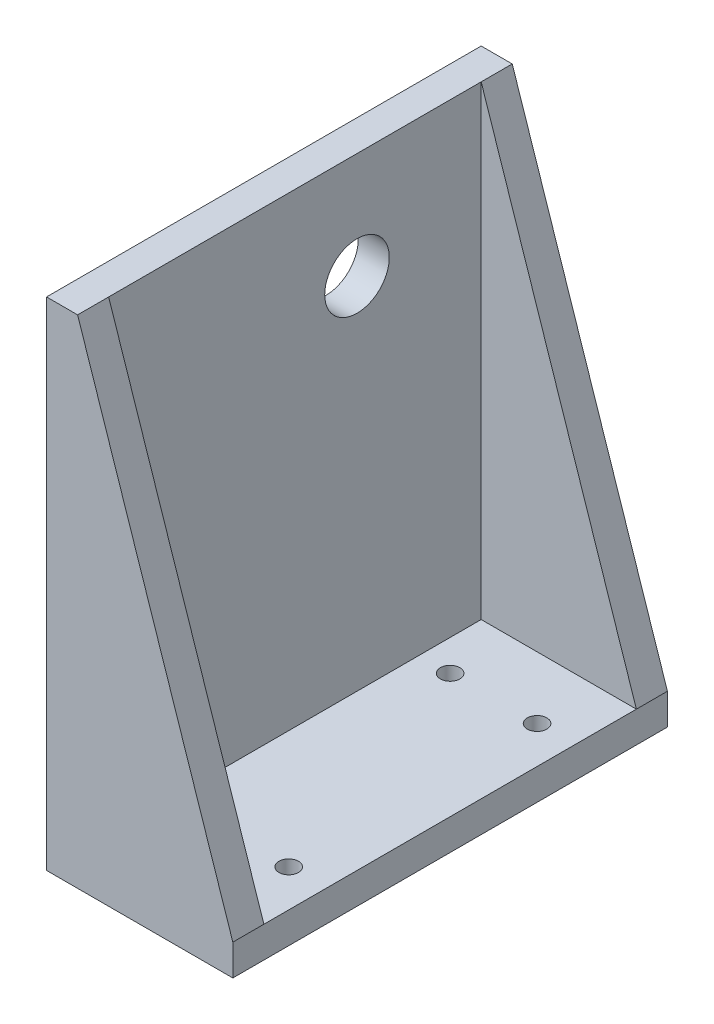
ISO-10303-21;
HEADER;
FILE_DESCRIPTION(('STEP AP214'),'2;1');
FILE_NAME('part.step','',(''),(''),'','','');
FILE_SCHEMA(('AUTOMOTIVE_DESIGN { 1 0 10303 214 1 1 1 1 }'));
ENDSEC;
DATA;
#1=APPLICATION_CONTEXT('core data for automotive mechanical design processes');
#2=APPLICATION_PROTOCOL_DEFINITION('international standard','automotive_design',2000,#1);
#3=PRODUCT_CONTEXT('',#1,'mechanical');
#4=PRODUCT('Part','Part','',(#3));
#5=PRODUCT_RELATED_PRODUCT_CATEGORY('part','',(#4));
#6=PRODUCT_DEFINITION_FORMATION('','',#4);
#7=PRODUCT_DEFINITION_CONTEXT('part definition',#1,'design');
#8=PRODUCT_DEFINITION('design','',#6,#7);
#9=PRODUCT_DEFINITION_SHAPE('','',#8);
#10=(LENGTH_UNIT() NAMED_UNIT(*) SI_UNIT(.MILLI.,.METRE.));
#11=(NAMED_UNIT(*) PLANE_ANGLE_UNIT() SI_UNIT($,.RADIAN.));
#12=(NAMED_UNIT(*) SI_UNIT($,.STERADIAN.) SOLID_ANGLE_UNIT());
#13=UNCERTAINTY_MEASURE_WITH_UNIT(LENGTH_MEASURE(1.E-05),#10,'distance_accuracy_value','');
#14=(GEOMETRIC_REPRESENTATION_CONTEXT(3) GLOBAL_UNCERTAINTY_ASSIGNED_CONTEXT((#13)) GLOBAL_UNIT_ASSIGNED_CONTEXT((#10,
#11,#12)) REPRESENTATION_CONTEXT('',''));
#15=CARTESIAN_POINT('',(0.,0.,0.));
#16=DIRECTION('',(0.,0.,1.));
#17=DIRECTION('',(1.,0.,0.));
#18=AXIS2_PLACEMENT_3D('',#15,#16,#17);
#19=CARTESIAN_POINT('',(3.175,3.175,22.225));
#20=DIRECTION('',(0.,-1.,0.));
#21=DIRECTION('',(1.,0.,0.));
#22=AXIS2_PLACEMENT_3D('',#19,#20,#21);
#23=PLANE('',#22);
#24=CARTESIAN_POINT('',(6.35,3.175,12.7));
#25=DIRECTION('',(0.,1.,0.));
#26=DIRECTION('',(1.,0.,0.));
#27=AXIS2_PLACEMENT_3D('',#24,#25,#26);
#28=CIRCLE('',#27,1.000000032);
#29=CARTESIAN_POINT('',(7.350000032,3.175,12.7));
#30=VERTEX_POINT('',#29);
#31=EDGE_CURVE('E254',#30,#30,#28,.T.);
#32=ORIENTED_EDGE('',*,*,#31,.F.);
#33=EDGE_LOOP('',(#32));
#34=FACE_BOUND('',#33,.T.);
#35=CARTESIAN_POINT('',(15.24,3.175,12.7));
#36=DIRECTION('',(0.,1.,0.));
#37=DIRECTION('',(1.,0.,0.));
#38=AXIS2_PLACEMENT_3D('',#35,#36,#37);
#39=CIRCLE('',#38,1.000000032);
#40=CARTESIAN_POINT('',(16.240000032,3.175,12.7));
#41=VERTEX_POINT('',#40);
#42=EDGE_CURVE('E258',#41,#41,#39,.T.);
#43=ORIENTED_EDGE('',*,*,#42,.F.);
#44=EDGE_LOOP('',(#43));
#45=FACE_BOUND('',#44,.T.);
#46=CARTESIAN_POINT('',(15.24,3.175,-12.7));
#47=DIRECTION('',(0.,1.,0.));
#48=DIRECTION('',(-1.,0.,0.));
#49=AXIS2_PLACEMENT_3D('',#46,#47,#48);
#50=CIRCLE('',#49,1.000000032);
#51=CARTESIAN_POINT('',(14.239999968,3.175,-12.7));
#52=VERTEX_POINT('',#51);
#53=EDGE_CURVE('E251',#52,#52,#50,.T.);
#54=ORIENTED_EDGE('',*,*,#53,.F.);
#55=EDGE_LOOP('',(#54));
#56=FACE_BOUND('',#55,.T.);
#57=CARTESIAN_POINT('',(6.35,3.175,-12.7));
#58=DIRECTION('',(0.,1.,0.));
#59=DIRECTION('',(-1.,0.,0.));
#60=AXIS2_PLACEMENT_3D('',#57,#58,#59);
#61=CIRCLE('',#60,1.000000032);
#62=CARTESIAN_POINT('',(5.34999996799999,3.175,-12.7));
#63=VERTEX_POINT('',#62);
#64=EDGE_CURVE('E248',#63,#63,#61,.T.);
#65=ORIENTED_EDGE('',*,*,#64,.F.);
#66=EDGE_LOOP('',(#65));
#67=FACE_BOUND('',#66,.T.);
#68=DIRECTION('',(1.,0.,0.));
#69=VECTOR('',#68,1.);
#70=CARTESIAN_POINT('',(19.05,3.175,-19.05));
#71=LINE('',#70,#69);
#72=CARTESIAN_POINT('',(3.175,3.175,-19.05));
#73=VERTEX_POINT('',#72);
#74=CARTESIAN_POINT('',(19.05,3.175,-19.05));
#75=VERTEX_POINT('',#74);
#76=EDGE_CURVE('E55',#73,#75,#71,.T.);
#77=ORIENTED_EDGE('',*,*,#76,.F.);
#78=DIRECTION('',(0.,0.,-1.));
#79=VECTOR('',#78,1.);
#80=CARTESIAN_POINT('',(3.175,3.175,22.225));
#81=LINE('',#80,#79);
#82=CARTESIAN_POINT('',(3.175,3.175,19.05));
#83=VERTEX_POINT('',#82);
#84=EDGE_CURVE('E117',#83,#73,#81,.T.);
#85=ORIENTED_EDGE('',*,*,#84,.F.);
#86=DIRECTION('',(1.,0.,0.));
#87=VECTOR('',#86,1.);
#88=CARTESIAN_POINT('',(19.05,3.175,19.05));
#89=LINE('',#88,#87);
#90=CARTESIAN_POINT('',(19.05,3.175,19.05));
#91=VERTEX_POINT('',#90);
#92=EDGE_CURVE('E107',#83,#91,#89,.T.);
#93=ORIENTED_EDGE('',*,*,#92,.T.);
#94=DIRECTION('',(0.,0.,-1.));
#95=VECTOR('',#94,1.);
#96=CARTESIAN_POINT('',(19.05,3.175,22.225));
#97=LINE('',#96,#95);
#98=EDGE_CURVE('E124',#91,#75,#97,.T.);
#99=ORIENTED_EDGE('',*,*,#98,.T.);
#100=EDGE_LOOP('',(#77,#85,#93,#99));
#101=FACE_BOUND('',#100,.T.);
#102=ADVANCED_FACE('F40',(#34,#45,#56,#67,#101),#23,.F.);
#103=CARTESIAN_POINT('',(3.175,50.8,22.225));
#104=DIRECTION('',(-1.,0.,0.));
#105=DIRECTION('',(0.,-1.,0.));
#106=AXIS2_PLACEMENT_3D('',#103,#104,#105);
#107=PLANE('',#106);
#108=CARTESIAN_POINT('',(3.175,39.9542,-6.35));
#109=DIRECTION('',(-1.,0.,0.));
#110=DIRECTION('',(0.,-1.,0.));
#111=AXIS2_PLACEMENT_3D('',#108,#109,#110);
#112=CIRCLE('',#111,3.302);
#113=CARTESIAN_POINT('',(3.175,39.9542,-3.048));
#114=VERTEX_POINT('',#113);
#115=EDGE_CURVE('E164',#114,#114,#112,.T.);
#116=ORIENTED_EDGE('',*,*,#115,.T.);
#117=EDGE_LOOP('',(#116));
#118=FACE_BOUND('',#117,.T.);
#119=DIRECTION('',(0.,-1.,0.));
#120=VECTOR('',#119,1.);
#121=CARTESIAN_POINT('',(3.175,3.175,-19.05));
#122=LINE('',#121,#120);
#123=CARTESIAN_POINT('',(3.175,50.8,-19.05));
#124=VERTEX_POINT('',#123);
#125=EDGE_CURVE('E143',#124,#73,#122,.T.);
#126=ORIENTED_EDGE('',*,*,#125,.F.);
#127=DIRECTION('',(0.,0.,-1.));
#128=VECTOR('',#127,1.);
#129=CARTESIAN_POINT('',(3.175,50.8,22.225));
#130=LINE('',#129,#128);
#131=CARTESIAN_POINT('',(3.175,50.8,19.05));
#132=VERTEX_POINT('',#131);
#133=EDGE_CURVE('E120',#132,#124,#130,.T.);
#134=ORIENTED_EDGE('',*,*,#133,.F.);
#135=DIRECTION('',(0.,-1.,0.));
#136=VECTOR('',#135,1.);
#137=CARTESIAN_POINT('',(3.175,3.175,19.05));
#138=LINE('',#137,#136);
#139=EDGE_CURVE('E110',#132,#83,#138,.T.);
#140=ORIENTED_EDGE('',*,*,#139,.T.);
#141=ORIENTED_EDGE('',*,*,#84,.T.);
#142=EDGE_LOOP('',(#126,#134,#140,#141));
#143=FACE_BOUND('',#142,.T.);
#144=ADVANCED_FACE('F116',(#118,#143),#107,.F.);
#145=CARTESIAN_POINT('',(19.05,0.,22.225));
#146=DIRECTION('',(0.,1.,0.));
#147=DIRECTION('',(-1.,0.,0.));
#148=AXIS2_PLACEMENT_3D('',#145,#146,#147);
#149=PLANE('',#148);
#150=CARTESIAN_POINT('',(6.34999999999999,0.,12.7));
#151=DIRECTION('',(0.,1.,0.));
#152=DIRECTION('',(1.,0.,0.));
#153=AXIS2_PLACEMENT_3D('',#150,#151,#152);
#154=CIRCLE('',#153,1.000000032);
#155=CARTESIAN_POINT('',(7.350000032,0.,12.7));
#156=VERTEX_POINT('',#155);
#157=EDGE_CURVE('E236',#156,#156,#154,.T.);
#158=ORIENTED_EDGE('',*,*,#157,.T.);
#159=EDGE_LOOP('',(#158));
#160=FACE_BOUND('',#159,.T.);
#161=CARTESIAN_POINT('',(15.24,0.,12.7));
#162=DIRECTION('',(0.,1.,0.));
#163=DIRECTION('',(1.,0.,0.));
#164=AXIS2_PLACEMENT_3D('',#161,#162,#163);
#165=CIRCLE('',#164,1.000000032);
#166=CARTESIAN_POINT('',(16.240000032,0.,12.7));
#167=VERTEX_POINT('',#166);
#168=EDGE_CURVE('E240',#167,#167,#165,.T.);
#169=ORIENTED_EDGE('',*,*,#168,.T.);
#170=EDGE_LOOP('',(#169));
#171=FACE_BOUND('',#170,.T.);
#172=CARTESIAN_POINT('',(15.24,0.,-12.7));
#173=DIRECTION('',(0.,1.,0.));
#174=DIRECTION('',(-1.,0.,0.));
#175=AXIS2_PLACEMENT_3D('',#172,#173,#174);
#176=CIRCLE('',#175,1.000000032);
#177=CARTESIAN_POINT('',(14.239999968,0.,-12.7));
#178=VERTEX_POINT('',#177);
#179=EDGE_CURVE('E244',#178,#178,#176,.T.);
#180=ORIENTED_EDGE('',*,*,#179,.T.);
#181=EDGE_LOOP('',(#180));
#182=FACE_BOUND('',#181,.T.);
#183=CARTESIAN_POINT('',(6.34999999999999,0.,-12.7));
#184=DIRECTION('',(0.,1.,0.));
#185=DIRECTION('',(-1.,0.,0.));
#186=AXIS2_PLACEMENT_3D('',#183,#184,#185);
#187=CIRCLE('',#186,1.000000032);
#188=CARTESIAN_POINT('',(5.34999996799999,0.,-12.7));
#189=VERTEX_POINT('',#188);
#190=EDGE_CURVE('E156',#189,#189,#187,.T.);
#191=ORIENTED_EDGE('',*,*,#190,.T.);
#192=EDGE_LOOP('',(#191));
#193=FACE_BOUND('',#192,.T.);
#194=DIRECTION('',(1.,0.,0.));
#195=VECTOR('',#194,1.);
#196=CARTESIAN_POINT('',(19.05,0.,-22.225));
#197=LINE('',#196,#195);
#198=CARTESIAN_POINT('',(0.,0.,-22.225));
#199=VERTEX_POINT('',#198);
#200=CARTESIAN_POINT('',(19.05,0.,-22.225));
#201=VERTEX_POINT('',#200);
#202=EDGE_CURVE('E167',#199,#201,#197,.T.);
#203=ORIENTED_EDGE('',*,*,#202,.T.);
#204=DIRECTION('',(0.,0.,-1.));
#205=VECTOR('',#204,1.);
#206=CARTESIAN_POINT('',(19.05,0.,22.225));
#207=LINE('',#206,#205);
#208=CARTESIAN_POINT('',(19.05,0.,22.225));
#209=VERTEX_POINT('',#208);
#210=EDGE_CURVE('E11',#209,#201,#207,.T.);
#211=ORIENTED_EDGE('',*,*,#210,.F.);
#212=DIRECTION('',(1.,0.,0.));
#213=VECTOR('',#212,1.);
#214=CARTESIAN_POINT('',(19.05,0.,22.225));
#215=LINE('',#214,#213);
#216=CARTESIAN_POINT('',(0.,0.,22.225));
#217=VERTEX_POINT('',#216);
#218=EDGE_CURVE('E168',#217,#209,#215,.T.);
#219=ORIENTED_EDGE('',*,*,#218,.F.);
#220=DIRECTION('',(0.,0.,-1.));
#221=VECTOR('',#220,1.);
#222=CARTESIAN_POINT('',(0.,0.,22.225));
#223=LINE('',#222,#221);
#224=EDGE_CURVE('E176',#217,#199,#223,.T.);
#225=ORIENTED_EDGE('',*,*,#224,.T.);
#226=EDGE_LOOP('',(#203,#211,#219,#225));
#227=FACE_BOUND('',#226,.T.);
#228=ADVANCED_FACE('F42',(#160,#171,#182,#193,#227),#149,.F.);
#229=CARTESIAN_POINT('',(19.05,3.175,22.225));
#230=DIRECTION('',(-1.,0.,0.));
#231=DIRECTION('',(0.,0.,1.));
#232=AXIS2_PLACEMENT_3D('',#229,#230,#231);
#233=PLANE('',#232);
#234=DIRECTION('',(0.,1.,0.));
#235=VECTOR('',#234,1.);
#236=CARTESIAN_POINT('',(19.05,3.175,-22.225));
#237=LINE('',#236,#235);
#238=CARTESIAN_POINT('',(19.05,3.175,-22.225));
#239=VERTEX_POINT('',#238);
#240=EDGE_CURVE('E179',#201,#239,#237,.T.);
#241=ORIENTED_EDGE('',*,*,#240,.T.);
#242=DIRECTION('',(0.,0.,-1.));
#243=VECTOR('',#242,1.);
#244=CARTESIAN_POINT('',(19.05,3.175,-19.05));
#245=LINE('',#244,#243);
#246=EDGE_CURVE('E63',#75,#239,#245,.T.);
#247=ORIENTED_EDGE('',*,*,#246,.F.);
#248=ORIENTED_EDGE('',*,*,#98,.F.);
#249=CARTESIAN_POINT('',(19.05,3.175,22.225));
#250=VERTEX_POINT('',#249);
#251=EDGE_CURVE('E48',#250,#91,#97,.T.);
#252=ORIENTED_EDGE('',*,*,#251,.F.);
#253=DIRECTION('',(0.,1.,0.));
#254=VECTOR('',#253,1.);
#255=CARTESIAN_POINT('',(19.05,3.175,22.225));
#256=LINE('',#255,#254);
#257=EDGE_CURVE('E135',#209,#250,#256,.T.);
#258=ORIENTED_EDGE('',*,*,#257,.F.);
#259=ORIENTED_EDGE('',*,*,#210,.T.);
#260=EDGE_LOOP('',(#241,#247,#248,#252,#258,#259));
#261=FACE_BOUND('',#260,.T.);
#262=ADVANCED_FACE('F134',(#261),#233,.F.);
#263=CARTESIAN_POINT('',(0.,50.8,22.225));
#264=DIRECTION('',(0.,-1.,0.));
#265=DIRECTION('',(0.,0.,-1.));
#266=AXIS2_PLACEMENT_3D('',#263,#264,#265);
#267=PLANE('',#266);
#268=DIRECTION('',(-1.,0.,0.));
#269=VECTOR('',#268,1.);
#270=CARTESIAN_POINT('',(0.,50.8,-22.225));
#271=LINE('',#270,#269);
#272=CARTESIAN_POINT('',(3.175,50.8,-22.225));
#273=VERTEX_POINT('',#272);
#274=CARTESIAN_POINT('',(0.,50.8,-22.225));
#275=VERTEX_POINT('',#274);
#276=EDGE_CURVE('E181',#273,#275,#271,.T.);
#277=ORIENTED_EDGE('',*,*,#276,.T.);
#278=DIRECTION('',(0.,0.,-1.));
#279=VECTOR('',#278,1.);
#280=CARTESIAN_POINT('',(0.,50.8,22.225));
#281=LINE('',#280,#279);
#282=CARTESIAN_POINT('',(0.,50.8,22.225));
#283=VERTEX_POINT('',#282);
#284=EDGE_CURVE('E185',#283,#275,#281,.T.);
#285=ORIENTED_EDGE('',*,*,#284,.F.);
#286=DIRECTION('',(-1.,0.,0.));
#287=VECTOR('',#286,1.);
#288=CARTESIAN_POINT('',(0.,50.8,22.225));
#289=LINE('',#288,#287);
#290=CARTESIAN_POINT('',(3.175,50.8,22.225));
#291=VERTEX_POINT('',#290);
#292=EDGE_CURVE('E172',#291,#283,#289,.T.);
#293=ORIENTED_EDGE('',*,*,#292,.F.);
#294=EDGE_CURVE('E125',#291,#132,#130,.T.);
#295=ORIENTED_EDGE('',*,*,#294,.T.);
#296=ORIENTED_EDGE('',*,*,#133,.T.);
#297=DIRECTION('',(0.,0.,-1.));
#298=VECTOR('',#297,1.);
#299=CARTESIAN_POINT('',(3.175,50.8,-19.05));
#300=LINE('',#299,#298);
#301=EDGE_CURVE('E144',#124,#273,#300,.T.);
#302=ORIENTED_EDGE('',*,*,#301,.T.);
#303=EDGE_LOOP('',(#277,#285,#293,#295,#296,#302));
#304=FACE_BOUND('',#303,.T.);
#305=ADVANCED_FACE('F192',(#304),#267,.F.);
#306=CARTESIAN_POINT('',(0.,0.,22.225));
#307=DIRECTION('',(1.,0.,0.));
#308=DIRECTION('',(0.,0.,-1.));
#309=AXIS2_PLACEMENT_3D('',#306,#307,#308);
#310=PLANE('',#309);
#311=CARTESIAN_POINT('',(0.,39.9542,-6.35));
#312=DIRECTION('',(-1.,0.,0.));
#313=DIRECTION('',(0.,0.,1.));
#314=AXIS2_PLACEMENT_3D('',#311,#312,#313);
#315=CIRCLE('',#314,3.302);
#316=CARTESIAN_POINT('',(0.,39.9542,-3.048));
#317=VERTEX_POINT('',#316);
#318=EDGE_CURVE('E160',#317,#317,#315,.T.);
#319=ORIENTED_EDGE('',*,*,#318,.F.);
#320=EDGE_LOOP('',(#319));
#321=FACE_BOUND('',#320,.T.);
#322=DIRECTION('',(0.,-1.,0.));
#323=VECTOR('',#322,1.);
#324=CARTESIAN_POINT('',(0.,0.,-22.225));
#325=LINE('',#324,#323);
#326=EDGE_CURVE('E170',#275,#199,#325,.T.);
#327=ORIENTED_EDGE('',*,*,#326,.T.);
#328=ORIENTED_EDGE('',*,*,#224,.F.);
#329=DIRECTION('',(0.,-1.,0.));
#330=VECTOR('',#329,1.);
#331=CARTESIAN_POINT('',(0.,0.,22.225));
#332=LINE('',#331,#330);
#333=EDGE_CURVE('E174',#283,#217,#332,.T.);
#334=ORIENTED_EDGE('',*,*,#333,.F.);
#335=ORIENTED_EDGE('',*,*,#284,.T.);
#336=EDGE_LOOP('',(#327,#328,#334,#335));
#337=FACE_BOUND('',#336,.T.);
#338=ADVANCED_FACE('F204',(#321,#337),#310,.F.);
#339=CARTESIAN_POINT('',(0.,0.,22.225));
#340=DIRECTION('',(0.,0.,-1.));
#341=DIRECTION('',(-1.,0.,0.));
#342=AXIS2_PLACEMENT_3D('',#339,#340,#341);
#343=PLANE('',#342);
#344=DIRECTION('',(-0.316227766016838,0.948683298050514,0.));
#345=VECTOR('',#344,1.);
#346=CARTESIAN_POINT('',(3.175,50.8,22.225));
#347=LINE('',#346,#345);
#348=EDGE_CURVE('E122',#250,#291,#347,.T.);
#349=ORIENTED_EDGE('',*,*,#348,.T.);
#350=ORIENTED_EDGE('',*,*,#292,.T.);
#351=ORIENTED_EDGE('',*,*,#333,.T.);
#352=ORIENTED_EDGE('',*,*,#218,.T.);
#353=ORIENTED_EDGE('',*,*,#257,.T.);
#354=EDGE_LOOP('',(#349,#350,#351,#352,#353));
#355=FACE_BOUND('',#354,.T.);
#356=ADVANCED_FACE('F196',(#355),#343,.F.);
#357=CARTESIAN_POINT('',(0.,0.,-22.225));
#358=DIRECTION('',(0.,0.,-1.));
#359=DIRECTION('',(-1.,0.,0.));
#360=AXIS2_PLACEMENT_3D('',#357,#358,#359);
#361=PLANE('',#360);
#362=ORIENTED_EDGE('',*,*,#276,.F.);
#363=DIRECTION('',(-0.316227766016838,0.948683298050514,0.));
#364=VECTOR('',#363,1.);
#365=CARTESIAN_POINT('',(3.175,50.8,-22.225));
#366=LINE('',#365,#364);
#367=EDGE_CURVE('E151',#239,#273,#366,.T.);
#368=ORIENTED_EDGE('',*,*,#367,.F.);
#369=ORIENTED_EDGE('',*,*,#240,.F.);
#370=ORIENTED_EDGE('',*,*,#202,.F.);
#371=ORIENTED_EDGE('',*,*,#326,.F.);
#372=EDGE_LOOP('',(#362,#368,#369,#370,#371));
#373=FACE_BOUND('',#372,.T.);
#374=ADVANCED_FACE('F203',(#373),#361,.T.);
#375=CARTESIAN_POINT('',(19.05,39.9542,-6.35));
#376=DIRECTION('',(-1.,0.,0.));
#377=DIRECTION('',(0.,0.,1.));
#378=AXIS2_PLACEMENT_3D('',#375,#376,#377);
#379=CYLINDRICAL_SURFACE('',#378,3.302);
#380=CARTESIAN_POINT('',(0.,39.9542,-3.048));
#381=CARTESIAN_POINT('',(0.0330729166666671,39.9542,-3.048));
#382=CARTESIAN_POINT('',(0.0661458333333342,39.9542,-3.048));
#383=CARTESIAN_POINT('',(0.132291666666667,39.9542,-3.048));
#384=CARTESIAN_POINT('',(0.165364583333333,39.9542,-3.048));
#385=CARTESIAN_POINT('',(0.231510416666666,39.9542,-3.048));
#386=CARTESIAN_POINT('',(0.264583333333333,39.9542,-3.048));
#387=CARTESIAN_POINT('',(0.330729166666667,39.9542,-3.048));
#388=CARTESIAN_POINT('',(0.363802083333334,39.9542,-3.048));
#389=CARTESIAN_POINT('',(0.429947916666667,39.9542,-3.048));
#390=CARTESIAN_POINT('',(0.463020833333333,39.9542,-3.048));
#391=CARTESIAN_POINT('',(0.529166666666666,39.9542,-3.048));
#392=CARTESIAN_POINT('',(0.562239583333333,39.9542,-3.048));
#393=CARTESIAN_POINT('',(0.628385416666667,39.9542,-3.048));
#394=CARTESIAN_POINT('',(0.661458333333334,39.9542,-3.048));
#395=CARTESIAN_POINT('',(0.727604166666669,39.9542,-3.048));
#396=CARTESIAN_POINT('',(0.760677083333336,39.9542,-3.048));
#397=CARTESIAN_POINT('',(0.826822916666669,39.9542,-3.048));
#398=CARTESIAN_POINT('',(0.859895833333335,39.9542,-3.048));
#399=CARTESIAN_POINT('',(0.926041666666668,39.9542,-3.048));
#400=CARTESIAN_POINT('',(0.959114583333335,39.9542,-3.048));
#401=CARTESIAN_POINT('',(1.02526041666667,39.9542,-3.048));
#402=CARTESIAN_POINT('',(1.05833333333334,39.9542,-3.048));
#403=CARTESIAN_POINT('',(1.12447916666667,39.9542,-3.048));
#404=CARTESIAN_POINT('',(1.15755208333333,39.9542,-3.048));
#405=CARTESIAN_POINT('',(1.22369791666667,39.9542,-3.048));
#406=CARTESIAN_POINT('',(1.25677083333333,39.9542,-3.048));
#407=CARTESIAN_POINT('',(1.32291666666667,39.9542,-3.048));
#408=CARTESIAN_POINT('',(1.35598958333334,39.9542,-3.048));
#409=CARTESIAN_POINT('',(1.42213541666667,39.9542,-3.048));
#410=CARTESIAN_POINT('',(1.45520833333333,39.9542,-3.048));
#411=CARTESIAN_POINT('',(1.52135416666667,39.9542,-3.048));
#412=CARTESIAN_POINT('',(1.55442708333333,39.9542,-3.048));
#413=CARTESIAN_POINT('',(1.62057291666667,39.9542,-3.048));
#414=CARTESIAN_POINT('',(1.65364583333334,39.9542,-3.048));
#415=CARTESIAN_POINT('',(1.71979166666667,39.9542,-3.048));
#416=CARTESIAN_POINT('',(1.75286458333334,39.9542,-3.048));
#417=CARTESIAN_POINT('',(1.81901041666667,39.9542,-3.048));
#418=CARTESIAN_POINT('',(1.85208333333334,39.9542,-3.048));
#419=CARTESIAN_POINT('',(1.91822916666667,39.9542,-3.048));
#420=CARTESIAN_POINT('',(1.95130208333334,39.9542,-3.048));
#421=CARTESIAN_POINT('',(2.01744791666667,39.9542,-3.048));
#422=CARTESIAN_POINT('',(2.05052083333334,39.9542,-3.048));
#423=CARTESIAN_POINT('',(2.11666666666667,39.9542,-3.048));
#424=CARTESIAN_POINT('',(2.14973958333334,39.9542,-3.048));
#425=CARTESIAN_POINT('',(2.21588541666667,39.9542,-3.048));
#426=CARTESIAN_POINT('',(2.24895833333334,39.9542,-3.048));
#427=CARTESIAN_POINT('',(2.31510416666667,39.9542,-3.048));
#428=CARTESIAN_POINT('',(2.34817708333334,39.9542,-3.048));
#429=CARTESIAN_POINT('',(2.41432291666667,39.9542,-3.048));
#430=CARTESIAN_POINT('',(2.44739583333334,39.9542,-3.048));
#431=CARTESIAN_POINT('',(2.51354166666667,39.9542,-3.048));
#432=CARTESIAN_POINT('',(2.54661458333334,39.9542,-3.048));
#433=CARTESIAN_POINT('',(2.61276041666667,39.9542,-3.048));
#434=CARTESIAN_POINT('',(2.64583333333334,39.9542,-3.048));
#435=CARTESIAN_POINT('',(2.71197916666667,39.9542,-3.048));
#436=CARTESIAN_POINT('',(2.74505208333334,39.9542,-3.048));
#437=CARTESIAN_POINT('',(2.81119791666667,39.9542,-3.048));
#438=CARTESIAN_POINT('',(2.84427083333334,39.9542,-3.048));
#439=CARTESIAN_POINT('',(2.91041666666667,39.9542,-3.048));
#440=CARTESIAN_POINT('',(2.94348958333334,39.9542,-3.048));
#441=CARTESIAN_POINT('',(3.00963541666667,39.9542,-3.048));
#442=CARTESIAN_POINT('',(3.04270833333334,39.9542,-3.048));
#443=CARTESIAN_POINT('',(3.10885416666667,39.9542,-3.048));
#444=CARTESIAN_POINT('',(3.14192708333334,39.9542,-3.048));
#445=CARTESIAN_POINT('',(3.175,39.9542,-3.048));
#446=B_SPLINE_CURVE_WITH_KNOTS('',3,(#380,#381,#382,#383,#384,#385,#386,#387,#388,#389,#390,
#391,#392,#393,#394,#395,#396,#397,#398,#399,#400,#401,#402,#403,#404,#405,#406,#407,#408,#409,
#410,#411,#412,#413,#414,#415,#416,#417,#418,#419,#420,#421,#422,#423,#424,#425,#426,#427,#428,
#429,#430,#431,#432,#433,#434,#435,#436,#437,#438,#439,#440,#441,#442,#443,#444,#445),
.UNSPECIFIED.,.F.,.F.,(4,2,2,2,2,2,2,2,2,2,2,2,2,2,2,2,2,2,2,2,2,2,2,2,2,2,2,2,2,2,2,2,4),(0.,
0.0992187500000012,0.198437499999999,0.29765625,0.396875000000001,0.496093749999999,0.5953125,
0.694531250000002,0.793750000000003,0.892968750000001,0.992187500000002,1.09140625,1.190625,
1.28984375,1.3890625,1.48828125,1.5875,1.68671875,1.7859375,1.88515625,1.984375,2.08359375,
2.1828125,2.28203125,2.38125,2.48046875,2.5796875,2.67890625,2.778125,2.87734375,
2.97656250000001,3.07578125,3.175),.UNSPECIFIED.);
#447=EDGE_CURVE('BSEAM291',#317,#114,#446,.T.);
#448=ORIENTED_EDGE('',*,*,#318,.T.);
#449=ORIENTED_EDGE('',*,*,#115,.F.);
#450=ORIENTED_EDGE('',*,*,#447,.T.);
#451=ORIENTED_EDGE('',*,*,#447,.F.);
#452=EDGE_LOOP('',(#448,#450,#449,#451));
#453=FACE_BOUND('',#452,.T.);
#454=ADVANCED_FACE('F291',(#453),#379,.F.);
#455=CARTESIAN_POINT('',(3.175,50.8,19.05));
#456=DIRECTION('',(0.948683298050514,0.316227766016838,0.));
#457=DIRECTION('',(-0.316227766016838,0.948683298050514,0.));
#458=AXIS2_PLACEMENT_3D('',#455,#456,#457);
#459=PLANE('',#458);
#460=ORIENTED_EDGE('',*,*,#348,.F.);
#461=ORIENTED_EDGE('',*,*,#251,.T.);
#462=DIRECTION('',(-0.316227766016838,0.948683298050514,0.));
#463=VECTOR('',#462,1.);
#464=CARTESIAN_POINT('',(3.175,50.8,19.05));
#465=LINE('',#464,#463);
#466=EDGE_CURVE('E112',#91,#132,#465,.T.);
#467=ORIENTED_EDGE('',*,*,#466,.T.);
#468=ORIENTED_EDGE('',*,*,#294,.F.);
#469=EDGE_LOOP('',(#460,#461,#467,#468));
#470=FACE_BOUND('',#469,.T.);
#471=ADVANCED_FACE('F131',(#470),#459,.T.);
#472=CARTESIAN_POINT('',(0.,0.,19.05));
#473=DIRECTION('',(0.,0.,1.));
#474=DIRECTION('',(1.,0.,0.));
#475=AXIS2_PLACEMENT_3D('',#472,#473,#474);
#476=PLANE('',#475);
#477=ORIENTED_EDGE('',*,*,#139,.F.);
#478=ORIENTED_EDGE('',*,*,#466,.F.);
#479=ORIENTED_EDGE('',*,*,#92,.F.);
#480=EDGE_LOOP('',(#477,#478,#479));
#481=FACE_BOUND('',#480,.T.);
#482=ADVANCED_FACE('F109',(#481),#476,.F.);
#483=CARTESIAN_POINT('',(3.175,50.8,-19.05));
#484=DIRECTION('',(-0.948683298050514,-0.316227766016838,0.));
#485=DIRECTION('',(0.316227766016838,-0.948683298050514,0.));
#486=AXIS2_PLACEMENT_3D('',#483,#484,#485);
#487=PLANE('',#486);
#488=ORIENTED_EDGE('',*,*,#367,.T.);
#489=ORIENTED_EDGE('',*,*,#301,.F.);
#490=DIRECTION('',(-0.316227766016838,0.948683298050514,0.));
#491=VECTOR('',#490,1.);
#492=CARTESIAN_POINT('',(3.175,50.8,-19.05));
#493=LINE('',#492,#491);
#494=EDGE_CURVE('E141',#75,#124,#493,.T.);
#495=ORIENTED_EDGE('',*,*,#494,.F.);
#496=ORIENTED_EDGE('',*,*,#246,.T.);
#497=EDGE_LOOP('',(#488,#489,#495,#496));
#498=FACE_BOUND('',#497,.T.);
#499=ADVANCED_FACE('F148',(#498),#487,.F.);
#500=CARTESIAN_POINT('',(0.,0.,-19.05));
#501=DIRECTION('',(0.,0.,-1.));
#502=DIRECTION('',(1.,0.,0.));
#503=AXIS2_PLACEMENT_3D('',#500,#501,#502);
#504=PLANE('',#503);
#505=ORIENTED_EDGE('',*,*,#125,.T.);
#506=ORIENTED_EDGE('',*,*,#76,.T.);
#507=ORIENTED_EDGE('',*,*,#494,.T.);
#508=EDGE_LOOP('',(#505,#506,#507));
#509=FACE_BOUND('',#508,.T.);
#510=ADVANCED_FACE('F140',(#509),#504,.F.);
#511=CARTESIAN_POINT('',(6.34999999999999,0.,-12.7));
#512=DIRECTION('',(0.,1.,0.));
#513=DIRECTION('',(-1.,0.,0.));
#514=AXIS2_PLACEMENT_3D('',#511,#512,#513);
#515=CYLINDRICAL_SURFACE('',#514,1.000000032);
#516=ORIENTED_EDGE('',*,*,#190,.F.);
#517=EDGE_LOOP('',(#516));
#518=FACE_BOUND('',#517,.T.);
#519=ORIENTED_EDGE('',*,*,#64,.T.);
#520=EDGE_LOOP('',(#519));
#521=FACE_BOUND('',#520,.T.);
#522=ADVANCED_FACE('F270',(#518,#521),#515,.F.);
#523=CARTESIAN_POINT('',(15.24,0.,-12.7));
#524=DIRECTION('',(0.,1.,0.));
#525=DIRECTION('',(-1.,0.,0.));
#526=AXIS2_PLACEMENT_3D('',#523,#524,#525);
#527=CYLINDRICAL_SURFACE('',#526,1.000000032);
#528=ORIENTED_EDGE('',*,*,#179,.F.);
#529=EDGE_LOOP('',(#528));
#530=FACE_BOUND('',#529,.T.);
#531=ORIENTED_EDGE('',*,*,#53,.T.);
#532=EDGE_LOOP('',(#531));
#533=FACE_BOUND('',#532,.T.);
#534=ADVANCED_FACE('F265',(#530,#533),#527,.F.);
#535=CARTESIAN_POINT('',(15.24,0.,12.7));
#536=DIRECTION('',(0.,1.,0.));
#537=DIRECTION('',(-1.,0.,0.));
#538=AXIS2_PLACEMENT_3D('',#535,#536,#537);
#539=CYLINDRICAL_SURFACE('',#538,1.000000032);
#540=ORIENTED_EDGE('',*,*,#168,.F.);
#541=EDGE_LOOP('',(#540));
#542=FACE_BOUND('',#541,.T.);
#543=ORIENTED_EDGE('',*,*,#42,.T.);
#544=EDGE_LOOP('',(#543));
#545=FACE_BOUND('',#544,.T.);
#546=ADVANCED_FACE('F277',(#542,#545),#539,.F.);
#547=CARTESIAN_POINT('',(6.34999999999999,0.,12.7));
#548=DIRECTION('',(0.,1.,0.));
#549=DIRECTION('',(-1.,0.,0.));
#550=AXIS2_PLACEMENT_3D('',#547,#548,#549);
#551=CYLINDRICAL_SURFACE('',#550,1.000000032);
#552=ORIENTED_EDGE('',*,*,#157,.F.);
#553=EDGE_LOOP('',(#552));
#554=FACE_BOUND('',#553,.T.);
#555=ORIENTED_EDGE('',*,*,#31,.T.);
#556=EDGE_LOOP('',(#555));
#557=FACE_BOUND('',#556,.T.);
#558=ADVANCED_FACE('F282',(#554,#557),#551,.F.);
#559=CLOSED_SHELL('',(#102,#144,#228,#262,#305,#338,#356,#374,#454,#471,#482,#499,#510,#522,
#534,#546,#558));
#560=MANIFOLD_SOLID_BREP('B2',#559);
#561=ADVANCED_BREP_SHAPE_REPRESENTATION('',(#18,#560),#14);
#562=SHAPE_DEFINITION_REPRESENTATION(#9,#561);
ENDSEC;
END-ISO-10303-21;
